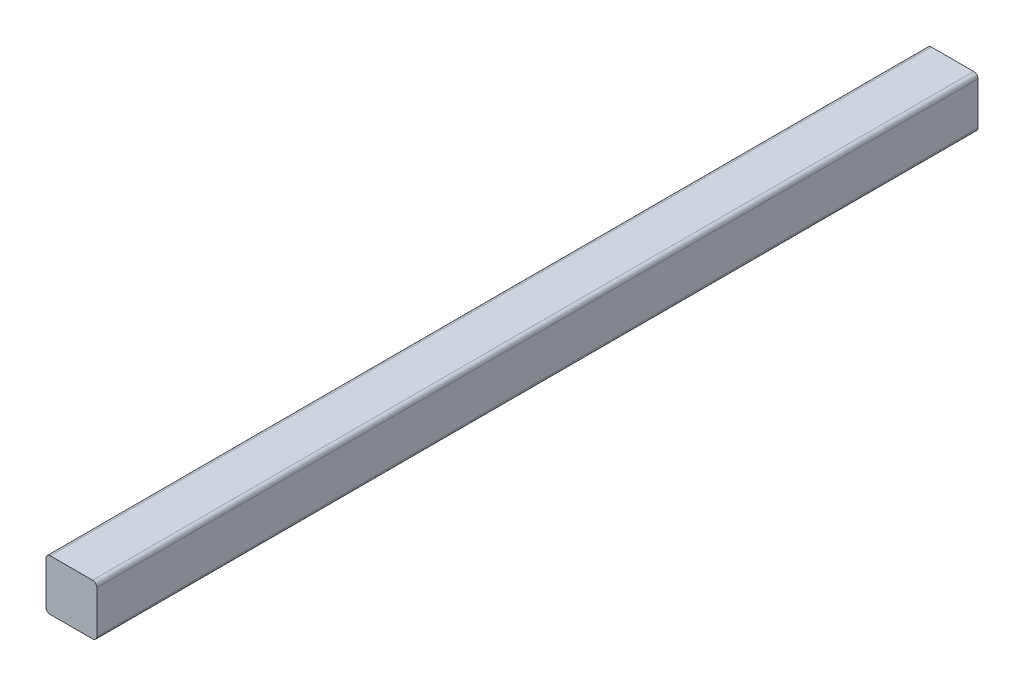
ISO-10303-21;
HEADER;
FILE_DESCRIPTION(('STEP AP214'),'2;1');
FILE_NAME('part.step','',(''),(''),'','','');
FILE_SCHEMA(('AUTOMOTIVE_DESIGN { 1 0 10303 214 1 1 1 1 }'));
ENDSEC;
DATA;
#1=APPLICATION_CONTEXT('core data for automotive mechanical design processes');
#2=APPLICATION_PROTOCOL_DEFINITION('international standard','automotive_design',2000,#1);
#3=PRODUCT_CONTEXT('',#1,'mechanical');
#4=PRODUCT('Part','Part','',(#3));
#5=PRODUCT_RELATED_PRODUCT_CATEGORY('part','',(#4));
#6=PRODUCT_DEFINITION_FORMATION('','',#4);
#7=PRODUCT_DEFINITION_CONTEXT('part definition',#1,'design');
#8=PRODUCT_DEFINITION('design','',#6,#7);
#9=PRODUCT_DEFINITION_SHAPE('','',#8);
#10=(LENGTH_UNIT() NAMED_UNIT(*) SI_UNIT(.MILLI.,.METRE.));
#11=(NAMED_UNIT(*) PLANE_ANGLE_UNIT() SI_UNIT($,.RADIAN.));
#12=(NAMED_UNIT(*) SI_UNIT($,.STERADIAN.) SOLID_ANGLE_UNIT());
#13=UNCERTAINTY_MEASURE_WITH_UNIT(LENGTH_MEASURE(1.E-05),#10,'distance_accuracy_value','');
#14=(GEOMETRIC_REPRESENTATION_CONTEXT(3) GLOBAL_UNCERTAINTY_ASSIGNED_CONTEXT((#13)) GLOBAL_UNIT_ASSIGNED_CONTEXT((#10,
#11,#12)) REPRESENTATION_CONTEXT('',''));
#15=CARTESIAN_POINT('',(0.,0.,0.));
#16=DIRECTION('',(0.,0.,1.));
#17=DIRECTION('',(1.,0.,0.));
#18=AXIS2_PLACEMENT_3D('',#15,#16,#17);
#19=CARTESIAN_POINT('',(19.05,-19.05,660.4));
#20=DIRECTION('',(-1.,0.,0.));
#21=DIRECTION('',(0.,0.,1.));
#22=AXIS2_PLACEMENT_3D('',#19,#20,#21);
#23=PLANE('',#22);
#24=DIRECTION('',(0.,1.,0.));
#25=VECTOR('',#24,1.);
#26=CARTESIAN_POINT('',(19.05,-19.05,660.4));
#27=LINE('',#26,#25);
#28=CARTESIAN_POINT('',(19.05,-15.875,660.4));
#29=VERTEX_POINT('',#28);
#30=CARTESIAN_POINT('',(19.05,15.875,660.4));
#31=VERTEX_POINT('',#30);
#32=EDGE_CURVE('E134',#29,#31,#27,.T.);
#33=ORIENTED_EDGE('',*,*,#32,.F.);
#34=DIRECTION('',(0.,0.,-1.));
#35=VECTOR('',#34,1.);
#36=CARTESIAN_POINT('',(19.05,-15.875,660.4));
#37=LINE('',#36,#35);
#38=CARTESIAN_POINT('',(19.05,-15.875,0.));
#39=VERTEX_POINT('',#38);
#40=EDGE_CURVE('E11',#29,#39,#37,.T.);
#41=ORIENTED_EDGE('',*,*,#40,.T.);
#42=DIRECTION('',(0.,1.,0.));
#43=VECTOR('',#42,1.);
#44=CARTESIAN_POINT('',(19.05,-19.05,0.));
#45=LINE('',#44,#43);
#46=CARTESIAN_POINT('',(19.05,15.875,0.));
#47=VERTEX_POINT('',#46);
#48=EDGE_CURVE('E136',#39,#47,#45,.T.);
#49=ORIENTED_EDGE('',*,*,#48,.T.);
#50=DIRECTION('',(0.,0.,-1.));
#51=VECTOR('',#50,1.);
#52=CARTESIAN_POINT('',(19.05,15.875,660.4));
#53=LINE('',#52,#51);
#54=EDGE_CURVE('E47',#47,#31,#53,.F.);
#55=ORIENTED_EDGE('',*,*,#54,.T.);
#56=EDGE_LOOP('',(#33,#41,#49,#55));
#57=FACE_BOUND('',#56,.T.);
#58=ADVANCED_FACE('F39',(#57),#23,.F.);
#59=CARTESIAN_POINT('',(-19.05,19.05,660.4));
#60=DIRECTION('',(0.,-1.,0.));
#61=DIRECTION('',(0.,0.,-1.));
#62=AXIS2_PLACEMENT_3D('',#59,#60,#61);
#63=PLANE('',#62);
#64=DIRECTION('',(-1.,0.,0.));
#65=VECTOR('',#64,1.);
#66=CARTESIAN_POINT('',(-19.05,19.05,0.));
#67=LINE('',#66,#65);
#68=CARTESIAN_POINT('',(15.875,19.05,0.));
#69=VERTEX_POINT('',#68);
#70=CARTESIAN_POINT('',(-15.875,19.05,0.));
#71=VERTEX_POINT('',#70);
#72=EDGE_CURVE('E132',#69,#71,#67,.T.);
#73=ORIENTED_EDGE('',*,*,#72,.T.);
#74=DIRECTION('',(0.,0.,-1.));
#75=VECTOR('',#74,1.);
#76=CARTESIAN_POINT('',(-15.875,19.05,660.4));
#77=LINE('',#76,#75);
#78=CARTESIAN_POINT('',(-15.875,19.05,660.4));
#79=VERTEX_POINT('',#78);
#80=EDGE_CURVE('E111',#71,#79,#77,.F.);
#81=ORIENTED_EDGE('',*,*,#80,.T.);
#82=DIRECTION('',(-1.,0.,0.));
#83=VECTOR('',#82,1.);
#84=CARTESIAN_POINT('',(-19.05,19.05,660.4));
#85=LINE('',#84,#83);
#86=CARTESIAN_POINT('',(15.875,19.05,660.4));
#87=VERTEX_POINT('',#86);
#88=EDGE_CURVE('E172',#87,#79,#85,.T.);
#89=ORIENTED_EDGE('',*,*,#88,.F.);
#90=DIRECTION('',(0.,0.,-1.));
#91=VECTOR('',#90,1.);
#92=CARTESIAN_POINT('',(15.875,19.05,660.4));
#93=LINE('',#92,#91);
#94=EDGE_CURVE('E116',#87,#69,#93,.T.);
#95=ORIENTED_EDGE('',*,*,#94,.T.);
#96=EDGE_LOOP('',(#73,#81,#89,#95));
#97=FACE_BOUND('',#96,.T.);
#98=ADVANCED_FACE('F176',(#97),#63,.F.);
#99=CARTESIAN_POINT('',(-19.05,-19.05,660.4));
#100=DIRECTION('',(1.,0.,0.));
#101=DIRECTION('',(0.,0.,-1.));
#102=AXIS2_PLACEMENT_3D('',#99,#100,#101);
#103=PLANE('',#102);
#104=DIRECTION('',(0.,-1.,0.));
#105=VECTOR('',#104,1.);
#106=CARTESIAN_POINT('',(-19.05,-19.05,660.4));
#107=LINE('',#106,#105);
#108=CARTESIAN_POINT('',(-19.05,15.875,660.4));
#109=VERTEX_POINT('',#108);
#110=CARTESIAN_POINT('',(-19.05,-15.875,660.4));
#111=VERTEX_POINT('',#110);
#112=EDGE_CURVE('E125',#109,#111,#107,.T.);
#113=ORIENTED_EDGE('',*,*,#112,.F.);
#114=DIRECTION('',(0.,0.,-1.));
#115=VECTOR('',#114,1.);
#116=CARTESIAN_POINT('',(-19.05,15.875,660.4));
#117=LINE('',#116,#115);
#118=CARTESIAN_POINT('',(-19.05,15.875,0.));
#119=VERTEX_POINT('',#118);
#120=EDGE_CURVE('E110',#109,#119,#117,.T.);
#121=ORIENTED_EDGE('',*,*,#120,.T.);
#122=DIRECTION('',(0.,-1.,0.));
#123=VECTOR('',#122,1.);
#124=CARTESIAN_POINT('',(-19.05,-19.05,0.));
#125=LINE('',#124,#123);
#126=CARTESIAN_POINT('',(-19.05,-15.875,0.));
#127=VERTEX_POINT('',#126);
#128=EDGE_CURVE('E123',#119,#127,#125,.T.);
#129=ORIENTED_EDGE('',*,*,#128,.T.);
#130=DIRECTION('',(0.,0.,-1.));
#131=VECTOR('',#130,1.);
#132=CARTESIAN_POINT('',(-19.05,-15.875,660.4));
#133=LINE('',#132,#131);
#134=EDGE_CURVE('E127',#127,#111,#133,.F.);
#135=ORIENTED_EDGE('',*,*,#134,.T.);
#136=EDGE_LOOP('',(#113,#121,#129,#135));
#137=FACE_BOUND('',#136,.T.);
#138=ADVANCED_FACE('F122',(#137),#103,.F.);
#139=CARTESIAN_POINT('',(-19.05,-19.05,660.4));
#140=DIRECTION('',(0.,1.,0.));
#141=DIRECTION('',(0.,0.,1.));
#142=AXIS2_PLACEMENT_3D('',#139,#140,#141);
#143=PLANE('',#142);
#144=DIRECTION('',(1.,0.,0.));
#145=VECTOR('',#144,1.);
#146=CARTESIAN_POINT('',(-19.05,-19.05,660.4));
#147=LINE('',#146,#145);
#148=CARTESIAN_POINT('',(-15.875,-19.05,660.4));
#149=VERTEX_POINT('',#148);
#150=CARTESIAN_POINT('',(15.875,-19.05,660.4));
#151=VERTEX_POINT('',#150);
#152=EDGE_CURVE('E140',#149,#151,#147,.T.);
#153=ORIENTED_EDGE('',*,*,#152,.F.);
#154=DIRECTION('',(0.,0.,-1.));
#155=VECTOR('',#154,1.);
#156=CARTESIAN_POINT('',(-15.875,-19.05,660.4));
#157=LINE('',#156,#155);
#158=CARTESIAN_POINT('',(-15.875,-19.05,0.));
#159=VERTEX_POINT('',#158);
#160=EDGE_CURVE('E157',#149,#159,#157,.T.);
#161=ORIENTED_EDGE('',*,*,#160,.T.);
#162=DIRECTION('',(1.,0.,0.));
#163=VECTOR('',#162,1.);
#164=CARTESIAN_POINT('',(-19.05,-19.05,0.));
#165=LINE('',#164,#163);
#166=CARTESIAN_POINT('',(15.875,-19.05,0.));
#167=VERTEX_POINT('',#166);
#168=EDGE_CURVE('E131',#159,#167,#165,.T.);
#169=ORIENTED_EDGE('',*,*,#168,.T.);
#170=DIRECTION('',(0.,0.,-1.));
#171=VECTOR('',#170,1.);
#172=CARTESIAN_POINT('',(15.875,-19.05,660.4));
#173=LINE('',#172,#171);
#174=EDGE_CURVE('E54',#167,#151,#173,.F.);
#175=ORIENTED_EDGE('',*,*,#174,.T.);
#176=EDGE_LOOP('',(#153,#161,#169,#175));
#177=FACE_BOUND('',#176,.T.);
#178=ADVANCED_FACE('F183',(#177),#143,.F.);
#179=CARTESIAN_POINT('',(0.,0.,660.4));
#180=DIRECTION('',(0.,0.,-1.));
#181=DIRECTION('',(-1.,0.,0.));
#182=AXIS2_PLACEMENT_3D('',#179,#180,#181);
#183=PLANE('',#182);
#184=ORIENTED_EDGE('',*,*,#88,.T.);
#185=CARTESIAN_POINT('',(-15.875,15.875,660.4));
#186=DIRECTION('',(0.,0.,-1.));
#187=DIRECTION('',(-1.,0.,0.));
#188=AXIS2_PLACEMENT_3D('',#185,#186,#187);
#189=CIRCLE('',#188,3.175);
#190=EDGE_CURVE('E154',#79,#109,#189,.F.);
#191=ORIENTED_EDGE('',*,*,#190,.T.);
#192=ORIENTED_EDGE('',*,*,#112,.T.);
#193=CARTESIAN_POINT('',(-15.875,-15.875,660.4));
#194=DIRECTION('',(0.,0.,-1.));
#195=DIRECTION('',(-1.,0.,0.));
#196=AXIS2_PLACEMENT_3D('',#193,#194,#195);
#197=CIRCLE('',#196,3.175);
#198=EDGE_CURVE('E61',#111,#149,#197,.F.);
#199=ORIENTED_EDGE('',*,*,#198,.T.);
#200=ORIENTED_EDGE('',*,*,#152,.T.);
#201=CARTESIAN_POINT('',(15.875,-15.875,660.4));
#202=DIRECTION('',(0.,0.,-1.));
#203=DIRECTION('',(-1.,0.,0.));
#204=AXIS2_PLACEMENT_3D('',#201,#202,#203);
#205=CIRCLE('',#204,3.175);
#206=EDGE_CURVE('E151',#151,#29,#205,.F.);
#207=ORIENTED_EDGE('',*,*,#206,.T.);
#208=ORIENTED_EDGE('',*,*,#32,.T.);
#209=CARTESIAN_POINT('',(15.875,15.875,660.4));
#210=DIRECTION('',(0.,0.,-1.));
#211=DIRECTION('',(-1.,0.,0.));
#212=AXIS2_PLACEMENT_3D('',#209,#210,#211);
#213=CIRCLE('',#212,3.175);
#214=EDGE_CURVE('E149',#31,#87,#213,.F.);
#215=ORIENTED_EDGE('',*,*,#214,.T.);
#216=EDGE_LOOP('',(#184,#191,#192,#199,#200,#207,#208,#215));
#217=FACE_BOUND('',#216,.T.);
#218=ADVANCED_FACE('F169',(#217),#183,.F.);
#219=CARTESIAN_POINT('',(0.,0.,0.));
#220=DIRECTION('',(0.,0.,-1.));
#221=DIRECTION('',(-1.,0.,0.));
#222=AXIS2_PLACEMENT_3D('',#219,#220,#221);
#223=PLANE('',#222);
#224=ORIENTED_EDGE('',*,*,#128,.F.);
#225=CARTESIAN_POINT('',(-15.875,15.875,0.));
#226=DIRECTION('',(0.,0.,-1.));
#227=DIRECTION('',(-1.,0.,0.));
#228=AXIS2_PLACEMENT_3D('',#225,#226,#227);
#229=CIRCLE('',#228,3.175);
#230=EDGE_CURVE('E106',#119,#71,#229,.T.);
#231=ORIENTED_EDGE('',*,*,#230,.T.);
#232=ORIENTED_EDGE('',*,*,#72,.F.);
#233=CARTESIAN_POINT('',(15.875,15.875,0.));
#234=DIRECTION('',(0.,0.,-1.));
#235=DIRECTION('',(-1.,0.,0.));
#236=AXIS2_PLACEMENT_3D('',#233,#234,#235);
#237=CIRCLE('',#236,3.175);
#238=EDGE_CURVE('E126',#69,#47,#237,.T.);
#239=ORIENTED_EDGE('',*,*,#238,.T.);
#240=ORIENTED_EDGE('',*,*,#48,.F.);
#241=CARTESIAN_POINT('',(15.875,-15.875,0.));
#242=DIRECTION('',(0.,0.,-1.));
#243=DIRECTION('',(-1.,0.,0.));
#244=AXIS2_PLACEMENT_3D('',#241,#242,#243);
#245=CIRCLE('',#244,3.175);
#246=EDGE_CURVE('E143',#39,#167,#245,.T.);
#247=ORIENTED_EDGE('',*,*,#246,.T.);
#248=ORIENTED_EDGE('',*,*,#168,.F.);
#249=CARTESIAN_POINT('',(-15.875,-15.875,0.));
#250=DIRECTION('',(0.,0.,-1.));
#251=DIRECTION('',(-1.,0.,0.));
#252=AXIS2_PLACEMENT_3D('',#249,#250,#251);
#253=CIRCLE('',#252,3.175);
#254=EDGE_CURVE('E117',#159,#127,#253,.T.);
#255=ORIENTED_EDGE('',*,*,#254,.T.);
#256=EDGE_LOOP('',(#224,#231,#232,#239,#240,#247,#248,#255));
#257=FACE_BOUND('',#256,.T.);
#258=ADVANCED_FACE('F129',(#257),#223,.T.);
#259=CARTESIAN_POINT('',(-15.875,15.875,660.4));
#260=DIRECTION('',(0.,0.,-1.));
#261=DIRECTION('',(-1.,0.,0.));
#262=AXIS2_PLACEMENT_3D('',#259,#260,#261);
#263=CYLINDRICAL_SURFACE('',#262,3.175);
#264=ORIENTED_EDGE('',*,*,#190,.F.);
#265=ORIENTED_EDGE('',*,*,#80,.F.);
#266=ORIENTED_EDGE('',*,*,#230,.F.);
#267=ORIENTED_EDGE('',*,*,#120,.F.);
#268=EDGE_LOOP('',(#264,#265,#266,#267));
#269=FACE_BOUND('',#268,.T.);
#270=ADVANCED_FACE('F109',(#269),#263,.T.);
#271=CARTESIAN_POINT('',(-15.875,-15.875,660.4));
#272=DIRECTION('',(0.,0.,-1.));
#273=DIRECTION('',(-1.,0.,0.));
#274=AXIS2_PLACEMENT_3D('',#271,#272,#273);
#275=CYLINDRICAL_SURFACE('',#274,3.175);
#276=ORIENTED_EDGE('',*,*,#198,.F.);
#277=ORIENTED_EDGE('',*,*,#134,.F.);
#278=ORIENTED_EDGE('',*,*,#254,.F.);
#279=ORIENTED_EDGE('',*,*,#160,.F.);
#280=EDGE_LOOP('',(#276,#277,#278,#279));
#281=FACE_BOUND('',#280,.T.);
#282=ADVANCED_FACE('F182',(#281),#275,.T.);
#283=CARTESIAN_POINT('',(15.875,-15.875,660.4));
#284=DIRECTION('',(0.,0.,-1.));
#285=DIRECTION('',(-1.,0.,0.));
#286=AXIS2_PLACEMENT_3D('',#283,#284,#285);
#287=CYLINDRICAL_SURFACE('',#286,3.175);
#288=ORIENTED_EDGE('',*,*,#206,.F.);
#289=ORIENTED_EDGE('',*,*,#174,.F.);
#290=ORIENTED_EDGE('',*,*,#246,.F.);
#291=ORIENTED_EDGE('',*,*,#40,.F.);
#292=EDGE_LOOP('',(#288,#289,#290,#291));
#293=FACE_BOUND('',#292,.T.);
#294=ADVANCED_FACE('F185',(#293),#287,.T.);
#295=CARTESIAN_POINT('',(15.875,15.875,660.4));
#296=DIRECTION('',(0.,0.,-1.));
#297=DIRECTION('',(-1.,0.,0.));
#298=AXIS2_PLACEMENT_3D('',#295,#296,#297);
#299=CYLINDRICAL_SURFACE('',#298,3.175);
#300=ORIENTED_EDGE('',*,*,#214,.F.);
#301=ORIENTED_EDGE('',*,*,#54,.F.);
#302=ORIENTED_EDGE('',*,*,#238,.F.);
#303=ORIENTED_EDGE('',*,*,#94,.F.);
#304=EDGE_LOOP('',(#300,#301,#302,#303));
#305=FACE_BOUND('',#304,.T.);
#306=ADVANCED_FACE('F41',(#305),#299,.T.);
#307=CLOSED_SHELL('',(#58,#98,#138,#178,#218,#258,#270,#282,#294,#306));
#308=MANIFOLD_SOLID_BREP('B2',#307);
#309=ADVANCED_BREP_SHAPE_REPRESENTATION('',(#18,#308),#14);
#310=SHAPE_DEFINITION_REPRESENTATION(#9,#309);
ENDSEC;
END-ISO-10303-21;
